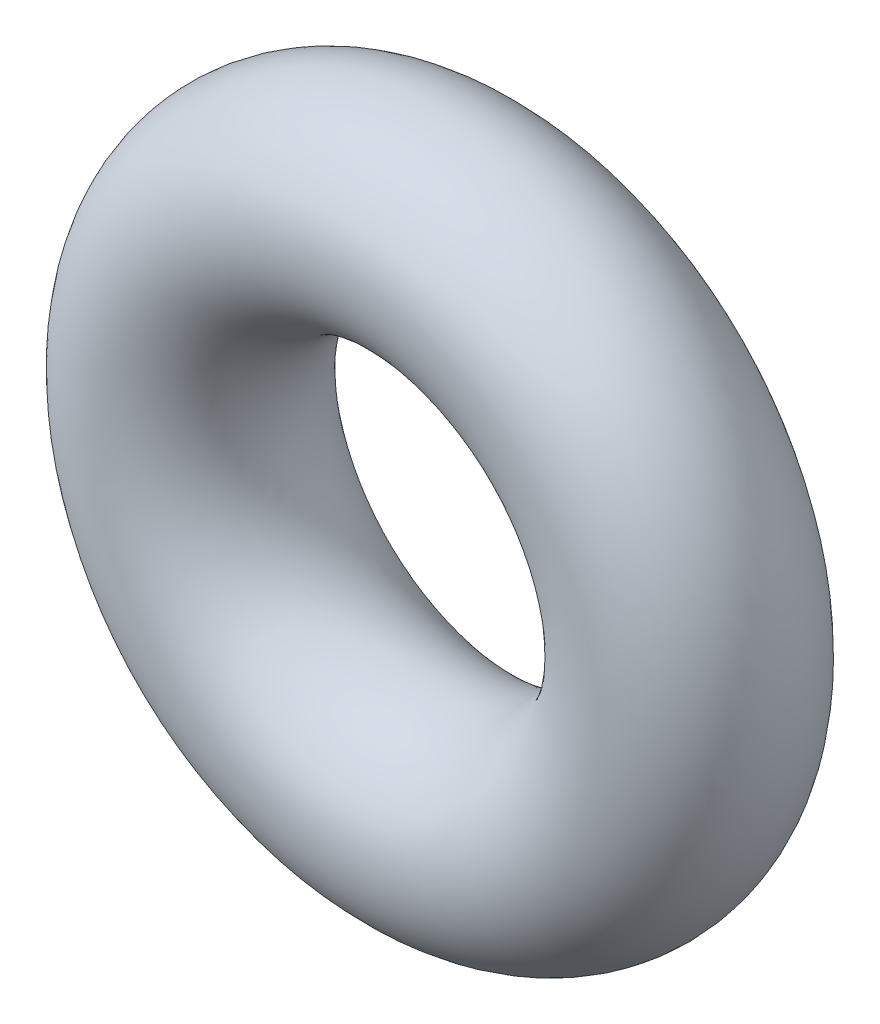
ISO-10303-21;
HEADER;
FILE_DESCRIPTION(('STEP AP214'),'2;1');
FILE_NAME('part.step','',(''),(''),'','','');
FILE_SCHEMA(('AUTOMOTIVE_DESIGN { 1 0 10303 214 1 1 1 1 }'));
ENDSEC;
DATA;
#1=APPLICATION_CONTEXT('core data for automotive mechanical design processes');
#2=APPLICATION_PROTOCOL_DEFINITION('international standard','automotive_design',2000,#1);
#3=PRODUCT_CONTEXT('',#1,'mechanical');
#4=PRODUCT('Part','Part','',(#3));
#5=PRODUCT_RELATED_PRODUCT_CATEGORY('part','',(#4));
#6=PRODUCT_DEFINITION_FORMATION('','',#4);
#7=PRODUCT_DEFINITION_CONTEXT('part definition',#1,'design');
#8=PRODUCT_DEFINITION('design','',#6,#7);
#9=PRODUCT_DEFINITION_SHAPE('','',#8);
#10=(LENGTH_UNIT() NAMED_UNIT(*) SI_UNIT(.MILLI.,.METRE.));
#11=(NAMED_UNIT(*) PLANE_ANGLE_UNIT() SI_UNIT($,.RADIAN.));
#12=(NAMED_UNIT(*) SI_UNIT($,.STERADIAN.) SOLID_ANGLE_UNIT());
#13=UNCERTAINTY_MEASURE_WITH_UNIT(LENGTH_MEASURE(1.E-05),#10,'distance_accuracy_value','');
#14=(GEOMETRIC_REPRESENTATION_CONTEXT(3) GLOBAL_UNCERTAINTY_ASSIGNED_CONTEXT((#13)) GLOBAL_UNIT_ASSIGNED_CONTEXT((#10,
#11,#12)) REPRESENTATION_CONTEXT('',''));
#15=CARTESIAN_POINT('',(0.,0.,0.));
#16=DIRECTION('',(0.,0.,1.));
#17=DIRECTION('',(1.,0.,0.));
#18=AXIS2_PLACEMENT_3D('',#15,#16,#17);
#19=CARTESIAN_POINT('',(0.,0.,0.));
#20=DIRECTION('',(0.,0.,1.));
#21=DIRECTION('',(1.,0.,0.));
#22=AXIS2_PLACEMENT_3D('',#19,#20,#21);
#23=TOROIDAL_SURFACE('',#22,2.1717,0.889);
#24=CARTESIAN_POINT('',(3.0607,0.,0.));
#25=VERTEX_POINT('',#24);
#26=VERTEX_LOOP('',#25);
#27=FACE_BOUND('',#26,.T.);
#28=ADVANCED_FACE('F28',(#27),#23,.T.);
#29=CLOSED_SHELL('',(#28));
#30=MANIFOLD_SOLID_BREP('B2',#29);
#31=ADVANCED_BREP_SHAPE_REPRESENTATION('',(#18,#30),#14);
#32=SHAPE_DEFINITION_REPRESENTATION(#9,#31);
ENDSEC;
END-ISO-10303-21;
